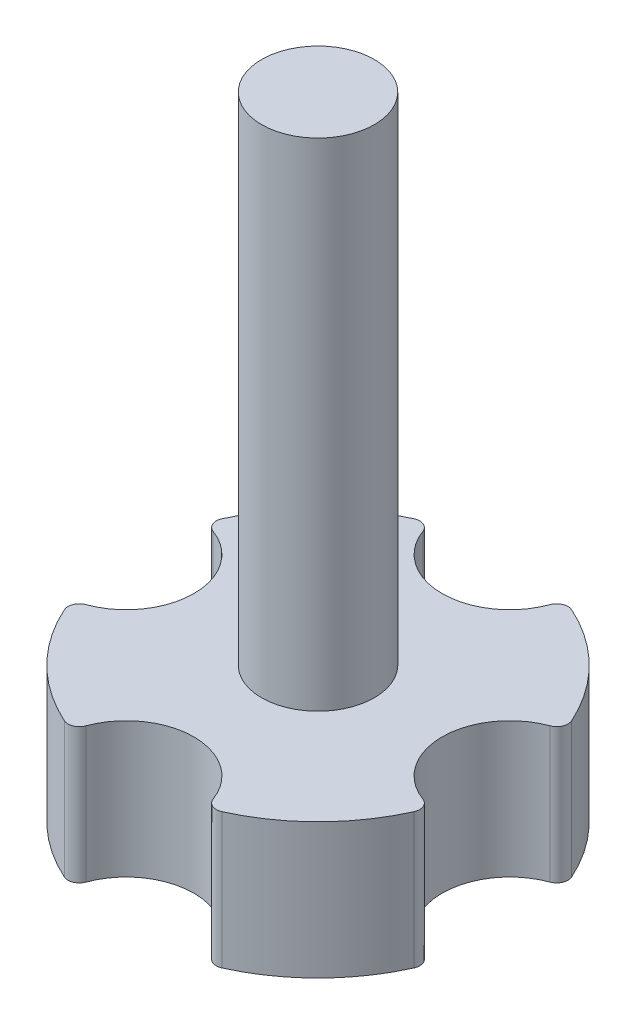
ISO-10303-21;
HEADER;
FILE_DESCRIPTION(('STEP AP214'),'2;1');
FILE_NAME('part.step','',(''),(''),'','','');
FILE_SCHEMA(('AUTOMOTIVE_DESIGN { 1 0 10303 214 1 1 1 1 }'));
ENDSEC;
DATA;
#1=APPLICATION_CONTEXT('core data for automotive mechanical design processes');
#2=APPLICATION_PROTOCOL_DEFINITION('international standard','automotive_design',2000,#1);
#3=PRODUCT_CONTEXT('',#1,'mechanical');
#4=PRODUCT('Part','Part','',(#3));
#5=PRODUCT_RELATED_PRODUCT_CATEGORY('part','',(#4));
#6=PRODUCT_DEFINITION_FORMATION('','',#4);
#7=PRODUCT_DEFINITION_CONTEXT('part definition',#1,'design');
#8=PRODUCT_DEFINITION('design','',#6,#7);
#9=PRODUCT_DEFINITION_SHAPE('','',#8);
#10=(LENGTH_UNIT() NAMED_UNIT(*) SI_UNIT(.MILLI.,.METRE.));
#11=(NAMED_UNIT(*) PLANE_ANGLE_UNIT() SI_UNIT($,.RADIAN.));
#12=(NAMED_UNIT(*) SI_UNIT($,.STERADIAN.) SOLID_ANGLE_UNIT());
#13=UNCERTAINTY_MEASURE_WITH_UNIT(LENGTH_MEASURE(1.E-05),#10,'distance_accuracy_value','');
#14=(GEOMETRIC_REPRESENTATION_CONTEXT(3) GLOBAL_UNCERTAINTY_ASSIGNED_CONTEXT((#13)) GLOBAL_UNIT_ASSIGNED_CONTEXT((#10,
#11,#12)) REPRESENTATION_CONTEXT('',''));
#15=CARTESIAN_POINT('',(0.,0.,0.));
#16=DIRECTION('',(0.,0.,1.));
#17=DIRECTION('',(1.,0.,0.));
#18=AXIS2_PLACEMENT_3D('',#15,#16,#17);
#19=CARTESIAN_POINT('',(0.,6.,0.));
#20=DIRECTION('',(0.,-1.,0.));
#21=DIRECTION('',(0.,0.,-1.));
#22=AXIS2_PLACEMENT_3D('',#19,#20,#21);
#23=CYLINDRICAL_SURFACE('',#22,8.5);
#24=CARTESIAN_POINT('',(0.,6.,0.));
#25=DIRECTION('',(0.,1.,0.));
#26=DIRECTION('',(0.,0.,1.));
#27=AXIS2_PLACEMENT_3D('',#24,#25,#26);
#28=CIRCLE('',#27,8.5);
#29=CARTESIAN_POINT('',(-7.75,6.,3.49106001094224));
#30=VERTEX_POINT('',#29);
#31=CARTESIAN_POINT('',(-3.49106001094223,6.,7.75));
#32=VERTEX_POINT('',#31);
#33=EDGE_CURVE('E173',#30,#32,#28,.T.);
#34=ORIENTED_EDGE('',*,*,#33,.F.);
#35=DIRECTION('',(0.,-1.,0.));
#36=VECTOR('',#35,1.);
#37=CARTESIAN_POINT('',(-7.75,6.,3.49106001094224));
#38=LINE('',#37,#36);
#39=CARTESIAN_POINT('',(-7.75,0.,3.49106001094224));
#40=VERTEX_POINT('',#39);
#41=EDGE_CURVE('E232',#30,#40,#38,.T.);
#42=ORIENTED_EDGE('',*,*,#41,.T.);
#43=CARTESIAN_POINT('',(0.,0.,0.));
#44=DIRECTION('',(0.,1.,0.));
#45=DIRECTION('',(0.,0.,1.));
#46=AXIS2_PLACEMENT_3D('',#43,#44,#45);
#47=CIRCLE('',#46,8.5);
#48=CARTESIAN_POINT('',(-3.49106001094223,0.,7.75));
#49=VERTEX_POINT('',#48);
#50=EDGE_CURVE('E258',#40,#49,#47,.T.);
#51=ORIENTED_EDGE('',*,*,#50,.T.);
#52=DIRECTION('',(0.,-1.,0.));
#53=VECTOR('',#52,1.);
#54=CARTESIAN_POINT('',(-3.49106001094223,6.,7.75));
#55=LINE('',#54,#53);
#56=EDGE_CURVE('E230',#49,#32,#55,.F.);
#57=ORIENTED_EDGE('',*,*,#56,.T.);
#58=EDGE_LOOP('',(#34,#42,#51,#57));
#59=FACE_BOUND('',#58,.T.);
#60=ADVANCED_FACE('F33',(#59),#23,.T.);
#61=CARTESIAN_POINT('',(3.49106001094223,0.,7.75));
#62=VERTEX_POINT('',#61);
#63=CARTESIAN_POINT('',(7.75,0.,3.49106001094223));
#64=VERTEX_POINT('',#63);
#65=EDGE_CURVE('E252',#62,#64,#47,.T.);
#66=ORIENTED_EDGE('',*,*,#65,.T.);
#67=DIRECTION('',(0.,-1.,0.));
#68=VECTOR('',#67,1.);
#69=CARTESIAN_POINT('',(7.75,6.,3.49106001094223));
#70=LINE('',#69,#68);
#71=CARTESIAN_POINT('',(7.75,6.,3.49106001094223));
#72=VERTEX_POINT('',#71);
#73=EDGE_CURVE('E213',#64,#72,#70,.F.);
#74=ORIENTED_EDGE('',*,*,#73,.T.);
#75=CARTESIAN_POINT('',(3.49106001094223,6.,7.75));
#76=VERTEX_POINT('',#75);
#77=EDGE_CURVE('E170',#76,#72,#28,.T.);
#78=ORIENTED_EDGE('',*,*,#77,.F.);
#79=DIRECTION('',(0.,-1.,0.));
#80=VECTOR('',#79,1.);
#81=CARTESIAN_POINT('',(3.49106001094223,6.,7.75));
#82=LINE('',#81,#80);
#83=EDGE_CURVE('E158',#76,#62,#82,.T.);
#84=ORIENTED_EDGE('',*,*,#83,.T.);
#85=EDGE_LOOP('',(#66,#74,#78,#84));
#86=FACE_BOUND('',#85,.T.);
#87=ADVANCED_FACE('F251',(#86),#23,.T.);
#88=CARTESIAN_POINT('',(7.75,6.,-3.49106001094223));
#89=VERTEX_POINT('',#88);
#90=CARTESIAN_POINT('',(3.49106001094224,6.,-7.75));
#91=VERTEX_POINT('',#90);
#92=EDGE_CURVE('E152',#89,#91,#28,.T.);
#93=ORIENTED_EDGE('',*,*,#92,.F.);
#94=DIRECTION('',(0.,-1.,0.));
#95=VECTOR('',#94,1.);
#96=CARTESIAN_POINT('',(7.75,6.,-3.49106001094223));
#97=LINE('',#96,#95);
#98=CARTESIAN_POINT('',(7.75,0.,-3.49106001094223));
#99=VERTEX_POINT('',#98);
#100=EDGE_CURVE('E166',#89,#99,#97,.T.);
#101=ORIENTED_EDGE('',*,*,#100,.T.);
#102=CARTESIAN_POINT('',(3.49106001094224,0.,-7.75));
#103=VERTEX_POINT('',#102);
#104=EDGE_CURVE('E259',#99,#103,#47,.T.);
#105=ORIENTED_EDGE('',*,*,#104,.T.);
#106=DIRECTION('',(0.,-1.,0.));
#107=VECTOR('',#106,1.);
#108=CARTESIAN_POINT('',(3.49106001094224,6.,-7.75));
#109=LINE('',#108,#107);
#110=EDGE_CURVE('E169',#103,#91,#109,.F.);
#111=ORIENTED_EDGE('',*,*,#110,.T.);
#112=EDGE_LOOP('',(#93,#101,#105,#111));
#113=FACE_BOUND('',#112,.T.);
#114=ADVANCED_FACE('F164',(#113),#23,.T.);
#115=CARTESIAN_POINT('',(0.,6.,0.));
#116=DIRECTION('',(0.,1.,0.));
#117=DIRECTION('',(0.,0.,1.));
#118=AXIS2_PLACEMENT_3D('',#115,#116,#117);
#119=PLANE('',#118);
#120=CARTESIAN_POINT('',(8.5,6.,0.));
#121=DIRECTION('',(0.,1.,0.));
#122=DIRECTION('',(0.,0.,1.));
#123=AXIS2_PLACEMENT_3D('',#120,#121,#122);
#124=CIRCLE('',#123,3.);
#125=CARTESIAN_POINT('',(7.46638655462185,6.,-2.81631731975172));
#126=VERTEX_POINT('',#125);
#127=CARTESIAN_POINT('',(7.46638655462185,6.,2.81631731975172));
#128=VERTEX_POINT('',#127);
#129=EDGE_CURVE('E154',#126,#128,#124,.T.);
#130=ORIENTED_EDGE('',*,*,#129,.F.);
#131=CARTESIAN_POINT('',(7.29411764705882,6.,-3.28570353971034));
#132=DIRECTION('',(0.,1.,0.));
#133=DIRECTION('',(0.,0.,1.));
#134=AXIS2_PLACEMENT_3D('',#131,#132,#133);
#135=CIRCLE('',#134,0.5);
#136=EDGE_CURVE('E148',#126,#89,#135,.T.);
#137=ORIENTED_EDGE('',*,*,#136,.T.);
#138=ORIENTED_EDGE('',*,*,#92,.T.);
#139=CARTESIAN_POINT('',(3.28570353971034,6.,-7.29411764705882));
#140=DIRECTION('',(0.,1.,0.));
#141=DIRECTION('',(0.,0.,1.));
#142=AXIS2_PLACEMENT_3D('',#139,#140,#141);
#143=CIRCLE('',#142,0.5);
#144=CARTESIAN_POINT('',(2.81631731975172,6.,-7.46638655462185));
#145=VERTEX_POINT('',#144);
#146=EDGE_CURVE('E208',#91,#145,#143,.T.);
#147=ORIENTED_EDGE('',*,*,#146,.T.);
#148=CARTESIAN_POINT('',(0.,6.,-8.5));
#149=DIRECTION('',(0.,1.,0.));
#150=DIRECTION('',(0.,0.,1.));
#151=AXIS2_PLACEMENT_3D('',#148,#149,#150);
#152=CIRCLE('',#151,3.);
#153=CARTESIAN_POINT('',(-2.81631731975172,6.,-7.46638655462185));
#154=VERTEX_POINT('',#153);
#155=EDGE_CURVE('E298',#154,#145,#152,.T.);
#156=ORIENTED_EDGE('',*,*,#155,.F.);
#157=CARTESIAN_POINT('',(-3.28570353971034,6.,-7.29411764705882));
#158=DIRECTION('',(0.,1.,0.));
#159=DIRECTION('',(0.,0.,1.));
#160=AXIS2_PLACEMENT_3D('',#157,#158,#159);
#161=CIRCLE('',#160,0.5);
#162=CARTESIAN_POINT('',(-3.49106001094224,6.,-7.75));
#163=VERTEX_POINT('',#162);
#164=EDGE_CURVE('E206',#154,#163,#161,.T.);
#165=ORIENTED_EDGE('',*,*,#164,.T.);
#166=CARTESIAN_POINT('',(-7.75,6.,-3.49106001094224));
#167=VERTEX_POINT('',#166);
#168=EDGE_CURVE('E171',#163,#167,#28,.T.);
#169=ORIENTED_EDGE('',*,*,#168,.T.);
#170=CARTESIAN_POINT('',(-7.29411764705882,6.,-3.28570353971034));
#171=DIRECTION('',(0.,1.,0.));
#172=DIRECTION('',(0.,0.,1.));
#173=AXIS2_PLACEMENT_3D('',#170,#171,#172);
#174=CIRCLE('',#173,0.5);
#175=CARTESIAN_POINT('',(-7.46638655462185,6.,-2.81631731975172));
#176=VERTEX_POINT('',#175);
#177=EDGE_CURVE('E204',#167,#176,#174,.T.);
#178=ORIENTED_EDGE('',*,*,#177,.T.);
#179=CARTESIAN_POINT('',(-8.5,6.,0.));
#180=DIRECTION('',(0.,1.,0.));
#181=DIRECTION('',(0.,0.,1.));
#182=AXIS2_PLACEMENT_3D('',#179,#180,#181);
#183=CIRCLE('',#182,3.);
#184=CARTESIAN_POINT('',(-7.46638655462185,6.,2.81631731975172));
#185=VERTEX_POINT('',#184);
#186=EDGE_CURVE('E452',#185,#176,#183,.T.);
#187=ORIENTED_EDGE('',*,*,#186,.F.);
#188=CARTESIAN_POINT('',(-7.29411764705882,6.,3.28570353971034));
#189=DIRECTION('',(0.,1.,0.));
#190=DIRECTION('',(0.,0.,1.));
#191=AXIS2_PLACEMENT_3D('',#188,#189,#190);
#192=CIRCLE('',#191,0.5);
#193=EDGE_CURVE('E56',#185,#30,#192,.T.);
#194=ORIENTED_EDGE('',*,*,#193,.T.);
#195=ORIENTED_EDGE('',*,*,#33,.T.);
#196=CARTESIAN_POINT('',(-3.28570353971034,6.,7.29411764705882));
#197=DIRECTION('',(0.,1.,0.));
#198=DIRECTION('',(0.,0.,1.));
#199=AXIS2_PLACEMENT_3D('',#196,#197,#198);
#200=CIRCLE('',#199,0.5);
#201=CARTESIAN_POINT('',(-2.81631731975172,6.,7.46638655462185));
#202=VERTEX_POINT('',#201);
#203=EDGE_CURVE('E48',#32,#202,#200,.T.);
#204=ORIENTED_EDGE('',*,*,#203,.T.);
#205=CARTESIAN_POINT('',(0.,6.,8.5));
#206=DIRECTION('',(0.,1.,0.));
#207=DIRECTION('',(0.,0.,1.));
#208=AXIS2_PLACEMENT_3D('',#205,#206,#207);
#209=CIRCLE('',#208,3.);
#210=CARTESIAN_POINT('',(2.81631731975172,6.,7.46638655462185));
#211=VERTEX_POINT('',#210);
#212=EDGE_CURVE('E240',#211,#202,#209,.T.);
#213=ORIENTED_EDGE('',*,*,#212,.F.);
#214=CARTESIAN_POINT('',(3.28570353971034,6.,7.29411764705882));
#215=DIRECTION('',(0.,1.,0.));
#216=DIRECTION('',(0.,0.,1.));
#217=AXIS2_PLACEMENT_3D('',#214,#215,#216);
#218=CIRCLE('',#217,0.5);
#219=EDGE_CURVE('E200',#211,#76,#218,.T.);
#220=ORIENTED_EDGE('',*,*,#219,.T.);
#221=ORIENTED_EDGE('',*,*,#77,.T.);
#222=CARTESIAN_POINT('',(7.29411764705882,6.,3.28570353971034));
#223=DIRECTION('',(0.,1.,0.));
#224=DIRECTION('',(0.,0.,1.));
#225=AXIS2_PLACEMENT_3D('',#222,#223,#224);
#226=CIRCLE('',#225,0.5);
#227=EDGE_CURVE('E159',#72,#128,#226,.T.);
#228=ORIENTED_EDGE('',*,*,#227,.T.);
#229=EDGE_LOOP('',(#130,#137,#138,#147,#156,#165,#169,#178,#187,#194,#195,#204,#213,#220,#221,#228));
#230=FACE_BOUND('',#229,.T.);
#231=CARTESIAN_POINT('',(0.,6.,0.));
#232=DIRECTION('',(0.,1.,0.));
#233=DIRECTION('',(0.,0.,1.));
#234=AXIS2_PLACEMENT_3D('',#231,#232,#233);
#235=CIRCLE('',#234,2.5);
#236=CARTESIAN_POINT('',(0.,6.,2.5));
#237=VERTEX_POINT('',#236);
#238=EDGE_CURVE('E453',#237,#237,#235,.T.);
#239=ORIENTED_EDGE('',*,*,#238,.F.);
#240=EDGE_LOOP('',(#239));
#241=FACE_BOUND('',#240,.T.);
#242=ADVANCED_FACE('F150',(#230,#241),#119,.T.);
#243=ORIENTED_EDGE('',*,*,#168,.F.);
#244=DIRECTION('',(0.,-1.,0.));
#245=VECTOR('',#244,1.);
#246=CARTESIAN_POINT('',(-3.49106001094224,6.,-7.75));
#247=LINE('',#246,#245);
#248=CARTESIAN_POINT('',(-3.49106001094224,0.,-7.75));
#249=VERTEX_POINT('',#248);
#250=EDGE_CURVE('E223',#163,#249,#247,.T.);
#251=ORIENTED_EDGE('',*,*,#250,.T.);
#252=CARTESIAN_POINT('',(-7.75,0.,-3.49106001094224));
#253=VERTEX_POINT('',#252);
#254=EDGE_CURVE('E262',#249,#253,#47,.T.);
#255=ORIENTED_EDGE('',*,*,#254,.T.);
#256=DIRECTION('',(0.,-1.,0.));
#257=VECTOR('',#256,1.);
#258=CARTESIAN_POINT('',(-7.75,6.,-3.49106001094224));
#259=LINE('',#258,#257);
#260=EDGE_CURVE('E220',#253,#167,#259,.F.);
#261=ORIENTED_EDGE('',*,*,#260,.T.);
#262=EDGE_LOOP('',(#243,#251,#255,#261));
#263=FACE_BOUND('',#262,.T.);
#264=ADVANCED_FACE('F286',(#263),#23,.T.);
#265=CARTESIAN_POINT('',(0.,0.,0.));
#266=DIRECTION('',(0.,1.,0.));
#267=DIRECTION('',(0.,0.,1.));
#268=AXIS2_PLACEMENT_3D('',#265,#266,#267);
#269=PLANE('',#268);
#270=ORIENTED_EDGE('',*,*,#104,.F.);
#271=CARTESIAN_POINT('',(7.29411764705882,0.,-3.28570353971034));
#272=DIRECTION('',(0.,1.,0.));
#273=DIRECTION('',(0.,0.,1.));
#274=AXIS2_PLACEMENT_3D('',#271,#272,#273);
#275=CIRCLE('',#274,0.5);
#276=CARTESIAN_POINT('',(7.46638655462185,0.,-2.81631731975172));
#277=VERTEX_POINT('',#276);
#278=EDGE_CURVE('E175',#99,#277,#275,.F.);
#279=ORIENTED_EDGE('',*,*,#278,.T.);
#280=CARTESIAN_POINT('',(8.5,0.,0.));
#281=DIRECTION('',(0.,1.,0.));
#282=DIRECTION('',(0.,0.,1.));
#283=AXIS2_PLACEMENT_3D('',#280,#281,#282);
#284=CIRCLE('',#283,3.);
#285=CARTESIAN_POINT('',(7.46638655462185,0.,2.81631731975172));
#286=VERTEX_POINT('',#285);
#287=EDGE_CURVE('E273',#277,#286,#284,.T.);
#288=ORIENTED_EDGE('',*,*,#287,.T.);
#289=CARTESIAN_POINT('',(7.29411764705882,0.,3.28570353971034));
#290=DIRECTION('',(0.,1.,0.));
#291=DIRECTION('',(0.,0.,1.));
#292=AXIS2_PLACEMENT_3D('',#289,#290,#291);
#293=CIRCLE('',#292,0.5);
#294=EDGE_CURVE('E193',#286,#64,#293,.F.);
#295=ORIENTED_EDGE('',*,*,#294,.T.);
#296=ORIENTED_EDGE('',*,*,#65,.F.);
#297=CARTESIAN_POINT('',(3.28570353971034,0.,7.29411764705882));
#298=DIRECTION('',(0.,1.,0.));
#299=DIRECTION('',(0.,0.,1.));
#300=AXIS2_PLACEMENT_3D('',#297,#298,#299);
#301=CIRCLE('',#300,0.5);
#302=CARTESIAN_POINT('',(2.81631731975172,0.,7.46638655462185));
#303=VERTEX_POINT('',#302);
#304=EDGE_CURVE('E176',#62,#303,#301,.F.);
#305=ORIENTED_EDGE('',*,*,#304,.T.);
#306=CARTESIAN_POINT('',(0.,0.,8.5));
#307=DIRECTION('',(0.,1.,0.));
#308=DIRECTION('',(0.,0.,1.));
#309=AXIS2_PLACEMENT_3D('',#306,#307,#308);
#310=CIRCLE('',#309,3.);
#311=CARTESIAN_POINT('',(-2.81631731975172,0.,7.46638655462185));
#312=VERTEX_POINT('',#311);
#313=EDGE_CURVE('E180',#303,#312,#310,.T.);
#314=ORIENTED_EDGE('',*,*,#313,.T.);
#315=CARTESIAN_POINT('',(-3.28570353971034,0.,7.29411764705882));
#316=DIRECTION('',(0.,1.,0.));
#317=DIRECTION('',(0.,0.,1.));
#318=AXIS2_PLACEMENT_3D('',#315,#316,#317);
#319=CIRCLE('',#318,0.5);
#320=EDGE_CURVE('E178',#312,#49,#319,.F.);
#321=ORIENTED_EDGE('',*,*,#320,.T.);
#322=ORIENTED_EDGE('',*,*,#50,.F.);
#323=CARTESIAN_POINT('',(-7.29411764705882,0.,3.28570353971034));
#324=DIRECTION('',(0.,1.,0.));
#325=DIRECTION('',(0.,0.,1.));
#326=AXIS2_PLACEMENT_3D('',#323,#324,#325);
#327=CIRCLE('',#326,0.5);
#328=CARTESIAN_POINT('',(-7.46638655462185,0.,2.81631731975172));
#329=VERTEX_POINT('',#328);
#330=EDGE_CURVE('E185',#40,#329,#327,.F.);
#331=ORIENTED_EDGE('',*,*,#330,.T.);
#332=CARTESIAN_POINT('',(-8.5,0.,0.));
#333=DIRECTION('',(0.,1.,0.));
#334=DIRECTION('',(0.,0.,1.));
#335=AXIS2_PLACEMENT_3D('',#332,#333,#334);
#336=CIRCLE('',#335,3.);
#337=CARTESIAN_POINT('',(-7.46638655462185,0.,-2.81631731975172));
#338=VERTEX_POINT('',#337);
#339=EDGE_CURVE('E267',#329,#338,#336,.T.);
#340=ORIENTED_EDGE('',*,*,#339,.T.);
#341=CARTESIAN_POINT('',(-7.29411764705882,0.,-3.28570353971034));
#342=DIRECTION('',(0.,1.,0.));
#343=DIRECTION('',(0.,0.,1.));
#344=AXIS2_PLACEMENT_3D('',#341,#342,#343);
#345=CIRCLE('',#344,0.5);
#346=EDGE_CURVE('E187',#338,#253,#345,.F.);
#347=ORIENTED_EDGE('',*,*,#346,.T.);
#348=ORIENTED_EDGE('',*,*,#254,.F.);
#349=CARTESIAN_POINT('',(-3.28570353971034,0.,-7.29411764705882));
#350=DIRECTION('',(0.,1.,0.));
#351=DIRECTION('',(0.,0.,1.));
#352=AXIS2_PLACEMENT_3D('',#349,#350,#351);
#353=CIRCLE('',#352,0.5);
#354=CARTESIAN_POINT('',(-2.81631731975172,0.,-7.46638655462185));
#355=VERTEX_POINT('',#354);
#356=EDGE_CURVE('E189',#249,#355,#353,.F.);
#357=ORIENTED_EDGE('',*,*,#356,.T.);
#358=CARTESIAN_POINT('',(0.,0.,-8.5));
#359=DIRECTION('',(0.,1.,0.));
#360=DIRECTION('',(0.,0.,1.));
#361=AXIS2_PLACEMENT_3D('',#358,#359,#360);
#362=CIRCLE('',#361,3.);
#363=CARTESIAN_POINT('',(2.81631731975172,0.,-7.46638655462185));
#364=VERTEX_POINT('',#363);
#365=EDGE_CURVE('E270',#355,#364,#362,.T.);
#366=ORIENTED_EDGE('',*,*,#365,.T.);
#367=CARTESIAN_POINT('',(3.28570353971034,0.,-7.29411764705882));
#368=DIRECTION('',(0.,1.,0.));
#369=DIRECTION('',(0.,0.,1.));
#370=AXIS2_PLACEMENT_3D('',#367,#368,#369);
#371=CIRCLE('',#370,0.5);
#372=EDGE_CURVE('E191',#364,#103,#371,.F.);
#373=ORIENTED_EDGE('',*,*,#372,.T.);
#374=EDGE_LOOP('',(#270,#279,#288,#295,#296,#305,#314,#321,#322,#331,#340,#347,#348,#357,#366,#373));
#375=FACE_BOUND('',#374,.T.);
#376=ADVANCED_FACE('F255',(#375),#269,.F.);
#377=CARTESIAN_POINT('',(0.,28.,0.));
#378=DIRECTION('',(0.,-1.,0.));
#379=DIRECTION('',(0.,0.,-1.));
#380=AXIS2_PLACEMENT_3D('',#377,#378,#379);
#381=CYLINDRICAL_SURFACE('',#380,2.5);
#382=CARTESIAN_POINT('',(0.,28.,0.));
#383=DIRECTION('',(0.,1.,0.));
#384=DIRECTION('',(0.,0.,1.));
#385=AXIS2_PLACEMENT_3D('',#382,#383,#384);
#386=CIRCLE('',#385,2.5);
#387=CARTESIAN_POINT('',(0.,28.,2.5));
#388=VERTEX_POINT('',#387);
#389=EDGE_CURVE('E265',#388,#388,#386,.T.);
#390=ORIENTED_EDGE('',*,*,#389,.F.);
#391=EDGE_LOOP('',(#390));
#392=FACE_BOUND('',#391,.T.);
#393=ORIENTED_EDGE('',*,*,#238,.T.);
#394=EDGE_LOOP('',(#393));
#395=FACE_BOUND('',#394,.T.);
#396=ADVANCED_FACE('F326',(#392,#395),#381,.T.);
#397=CARTESIAN_POINT('',(0.,28.,0.));
#398=DIRECTION('',(0.,1.,0.));
#399=DIRECTION('',(0.,0.,1.));
#400=AXIS2_PLACEMENT_3D('',#397,#398,#399);
#401=PLANE('',#400);
#402=ORIENTED_EDGE('',*,*,#389,.T.);
#403=EDGE_LOOP('',(#402));
#404=FACE_BOUND('',#403,.T.);
#405=ADVANCED_FACE('F359',(#404),#401,.T.);
#406=CARTESIAN_POINT('',(-8.5,-6.99999999999999,0.));
#407=DIRECTION('',(0.,1.,0.));
#408=DIRECTION('',(0.,0.,1.));
#409=AXIS2_PLACEMENT_3D('',#406,#407,#408);
#410=CYLINDRICAL_SURFACE('',#409,3.);
#411=ORIENTED_EDGE('',*,*,#186,.T.);
#412=DIRECTION('',(0.,1.,0.));
#413=VECTOR('',#412,1.);
#414=CARTESIAN_POINT('',(-7.46638655462185,-6.99999999999999,-2.81631731975172));
#415=LINE('',#414,#413);
#416=EDGE_CURVE('E228',#176,#338,#415,.F.);
#417=ORIENTED_EDGE('',*,*,#416,.T.);
#418=ORIENTED_EDGE('',*,*,#339,.F.);
#419=DIRECTION('',(0.,1.,0.));
#420=VECTOR('',#419,1.);
#421=CARTESIAN_POINT('',(-7.46638655462185,-6.99999999999999,2.81631731975172));
#422=LINE('',#421,#420);
#423=EDGE_CURVE('E226',#329,#185,#422,.T.);
#424=ORIENTED_EDGE('',*,*,#423,.T.);
#425=EDGE_LOOP('',(#411,#417,#418,#424));
#426=FACE_BOUND('',#425,.T.);
#427=ADVANCED_FACE('F354',(#426),#410,.F.);
#428=CARTESIAN_POINT('',(0.,-6.99999999999999,-8.5));
#429=DIRECTION('',(0.,1.,0.));
#430=DIRECTION('',(0.,0.,1.));
#431=AXIS2_PLACEMENT_3D('',#428,#429,#430);
#432=CYLINDRICAL_SURFACE('',#431,3.);
#433=ORIENTED_EDGE('',*,*,#155,.T.);
#434=DIRECTION('',(0.,1.,0.));
#435=VECTOR('',#434,1.);
#436=CARTESIAN_POINT('',(2.81631731975172,-6.99999999999999,-7.46638655462185));
#437=LINE('',#436,#435);
#438=EDGE_CURVE('E218',#145,#364,#437,.F.);
#439=ORIENTED_EDGE('',*,*,#438,.T.);
#440=ORIENTED_EDGE('',*,*,#365,.F.);
#441=DIRECTION('',(0.,1.,0.));
#442=VECTOR('',#441,1.);
#443=CARTESIAN_POINT('',(-2.81631731975172,-6.99999999999999,-7.46638655462185));
#444=LINE('',#443,#442);
#445=EDGE_CURVE('E216',#355,#154,#444,.T.);
#446=ORIENTED_EDGE('',*,*,#445,.T.);
#447=EDGE_LOOP('',(#433,#439,#440,#446));
#448=FACE_BOUND('',#447,.T.);
#449=ADVANCED_FACE('F296',(#448),#432,.F.);
#450=CARTESIAN_POINT('',(8.5,-6.99999999999999,0.));
#451=DIRECTION('',(0.,1.,0.));
#452=DIRECTION('',(0.,0.,1.));
#453=AXIS2_PLACEMENT_3D('',#450,#451,#452);
#454=CYLINDRICAL_SURFACE('',#453,3.);
#455=ORIENTED_EDGE('',*,*,#287,.F.);
#456=DIRECTION('',(0.,1.,0.));
#457=VECTOR('',#456,1.);
#458=CARTESIAN_POINT('',(7.46638655462185,-6.99999999999999,-2.81631731975172));
#459=LINE('',#458,#457);
#460=EDGE_CURVE('E198',#277,#126,#459,.T.);
#461=ORIENTED_EDGE('',*,*,#460,.T.);
#462=ORIENTED_EDGE('',*,*,#129,.T.);
#463=DIRECTION('',(0.,1.,0.));
#464=VECTOR('',#463,1.);
#465=CARTESIAN_POINT('',(7.46638655462185,-6.99999999999999,2.81631731975172));
#466=LINE('',#465,#464);
#467=EDGE_CURVE('E196',#128,#286,#466,.F.);
#468=ORIENTED_EDGE('',*,*,#467,.T.);
#469=EDGE_LOOP('',(#455,#461,#462,#468));
#470=FACE_BOUND('',#469,.T.);
#471=ADVANCED_FACE('F303',(#470),#454,.F.);
#472=CARTESIAN_POINT('',(0.,-6.99999999999999,8.5));
#473=DIRECTION('',(0.,1.,0.));
#474=DIRECTION('',(0.,0.,1.));
#475=AXIS2_PLACEMENT_3D('',#472,#473,#474);
#476=CYLINDRICAL_SURFACE('',#475,3.);
#477=ORIENTED_EDGE('',*,*,#212,.T.);
#478=DIRECTION('',(0.,1.,0.));
#479=VECTOR('',#478,1.);
#480=CARTESIAN_POINT('',(-2.81631731975172,-6.99999999999999,7.46638655462185));
#481=LINE('',#480,#479);
#482=EDGE_CURVE('E11',#202,#312,#481,.F.);
#483=ORIENTED_EDGE('',*,*,#482,.T.);
#484=ORIENTED_EDGE('',*,*,#313,.F.);
#485=DIRECTION('',(0.,1.,0.));
#486=VECTOR('',#485,1.);
#487=CARTESIAN_POINT('',(2.81631731975172,-6.99999999999999,7.46638655462185));
#488=LINE('',#487,#486);
#489=EDGE_CURVE('E41',#303,#211,#488,.T.);
#490=ORIENTED_EDGE('',*,*,#489,.T.);
#491=EDGE_LOOP('',(#477,#483,#484,#490));
#492=FACE_BOUND('',#491,.T.);
#493=ADVANCED_FACE('F239',(#492),#476,.F.);
#494=CARTESIAN_POINT('',(7.29411764705882,-6.99999999999999,-3.28570353971034));
#495=DIRECTION('',(0.,1.,0.));
#496=DIRECTION('',(0.,0.,1.));
#497=AXIS2_PLACEMENT_3D('',#494,#495,#496);
#498=CYLINDRICAL_SURFACE('',#497,0.5);
#499=ORIENTED_EDGE('',*,*,#136,.F.);
#500=ORIENTED_EDGE('',*,*,#460,.F.);
#501=ORIENTED_EDGE('',*,*,#278,.F.);
#502=ORIENTED_EDGE('',*,*,#100,.F.);
#503=EDGE_LOOP('',(#499,#500,#501,#502));
#504=FACE_BOUND('',#503,.T.);
#505=ADVANCED_FACE('F174',(#504),#498,.T.);
#506=CARTESIAN_POINT('',(7.29411764705882,-6.99999999999999,3.28570353971034));
#507=DIRECTION('',(0.,-1.,0.));
#508=DIRECTION('',(0.,0.,-1.));
#509=AXIS2_PLACEMENT_3D('',#506,#507,#508);
#510=CYLINDRICAL_SURFACE('',#509,0.5);
#511=ORIENTED_EDGE('',*,*,#294,.F.);
#512=ORIENTED_EDGE('',*,*,#467,.F.);
#513=ORIENTED_EDGE('',*,*,#227,.F.);
#514=ORIENTED_EDGE('',*,*,#73,.F.);
#515=EDGE_LOOP('',(#511,#512,#513,#514));
#516=FACE_BOUND('',#515,.T.);
#517=ADVANCED_FACE('F306',(#516),#510,.T.);
#518=CARTESIAN_POINT('',(3.28570353971034,-6.99999999999999,-7.29411764705882));
#519=DIRECTION('',(0.,-1.,0.));
#520=DIRECTION('',(0.,0.,-1.));
#521=AXIS2_PLACEMENT_3D('',#518,#519,#520);
#522=CYLINDRICAL_SURFACE('',#521,0.5);
#523=ORIENTED_EDGE('',*,*,#372,.F.);
#524=ORIENTED_EDGE('',*,*,#438,.F.);
#525=ORIENTED_EDGE('',*,*,#146,.F.);
#526=ORIENTED_EDGE('',*,*,#110,.F.);
#527=EDGE_LOOP('',(#523,#524,#525,#526));
#528=FACE_BOUND('',#527,.T.);
#529=ADVANCED_FACE('F300',(#528),#522,.T.);
#530=CARTESIAN_POINT('',(-3.28570353971034,-6.99999999999999,-7.29411764705882));
#531=DIRECTION('',(0.,1.,0.));
#532=DIRECTION('',(0.,0.,1.));
#533=AXIS2_PLACEMENT_3D('',#530,#531,#532);
#534=CYLINDRICAL_SURFACE('',#533,0.5);
#535=ORIENTED_EDGE('',*,*,#164,.F.);
#536=ORIENTED_EDGE('',*,*,#445,.F.);
#537=ORIENTED_EDGE('',*,*,#356,.F.);
#538=ORIENTED_EDGE('',*,*,#250,.F.);
#539=EDGE_LOOP('',(#535,#536,#537,#538));
#540=FACE_BOUND('',#539,.T.);
#541=ADVANCED_FACE('F290',(#540),#534,.T.);
#542=CARTESIAN_POINT('',(-7.29411764705882,-6.99999999999999,-3.28570353971034));
#543=DIRECTION('',(0.,-1.,0.));
#544=DIRECTION('',(0.,0.,-1.));
#545=AXIS2_PLACEMENT_3D('',#542,#543,#544);
#546=CYLINDRICAL_SURFACE('',#545,0.5);
#547=ORIENTED_EDGE('',*,*,#346,.F.);
#548=ORIENTED_EDGE('',*,*,#416,.F.);
#549=ORIENTED_EDGE('',*,*,#177,.F.);
#550=ORIENTED_EDGE('',*,*,#260,.F.);
#551=EDGE_LOOP('',(#547,#548,#549,#550));
#552=FACE_BOUND('',#551,.T.);
#553=ADVANCED_FACE('F411',(#552),#546,.T.);
#554=CARTESIAN_POINT('',(-7.29411764705882,-6.99999999999999,3.28570353971034));
#555=DIRECTION('',(0.,1.,0.));
#556=DIRECTION('',(0.,0.,1.));
#557=AXIS2_PLACEMENT_3D('',#554,#555,#556);
#558=CYLINDRICAL_SURFACE('',#557,0.5);
#559=ORIENTED_EDGE('',*,*,#193,.F.);
#560=ORIENTED_EDGE('',*,*,#423,.F.);
#561=ORIENTED_EDGE('',*,*,#330,.F.);
#562=ORIENTED_EDGE('',*,*,#41,.F.);
#563=EDGE_LOOP('',(#559,#560,#561,#562));
#564=FACE_BOUND('',#563,.T.);
#565=ADVANCED_FACE('F420',(#564),#558,.T.);
#566=CARTESIAN_POINT('',(-3.28570353971034,-6.99999999999999,7.29411764705882));
#567=DIRECTION('',(0.,-1.,0.));
#568=DIRECTION('',(0.,0.,-1.));
#569=AXIS2_PLACEMENT_3D('',#566,#567,#568);
#570=CYLINDRICAL_SURFACE('',#569,0.5);
#571=ORIENTED_EDGE('',*,*,#320,.F.);
#572=ORIENTED_EDGE('',*,*,#482,.F.);
#573=ORIENTED_EDGE('',*,*,#203,.F.);
#574=ORIENTED_EDGE('',*,*,#56,.F.);
#575=EDGE_LOOP('',(#571,#572,#573,#574));
#576=FACE_BOUND('',#575,.T.);
#577=ADVANCED_FACE('F276',(#576),#570,.T.);
#578=CARTESIAN_POINT('',(3.28570353971034,-6.99999999999999,7.29411764705882));
#579=DIRECTION('',(0.,1.,0.));
#580=DIRECTION('',(0.,0.,1.));
#581=AXIS2_PLACEMENT_3D('',#578,#579,#580);
#582=CYLINDRICAL_SURFACE('',#581,0.5);
#583=ORIENTED_EDGE('',*,*,#219,.F.);
#584=ORIENTED_EDGE('',*,*,#489,.F.);
#585=ORIENTED_EDGE('',*,*,#304,.F.);
#586=ORIENTED_EDGE('',*,*,#83,.F.);
#587=EDGE_LOOP('',(#583,#584,#585,#586));
#588=FACE_BOUND('',#587,.T.);
#589=ADVANCED_FACE('F35',(#588),#582,.T.);
#590=CLOSED_SHELL('',(#60,#87,#114,#242,#264,#376,#396,#405,#427,#449,#471,#493,#505,#517,#529,
#541,#553,#565,#577,#589));
#591=MANIFOLD_SOLID_BREP('B2',#590);
#592=ADVANCED_BREP_SHAPE_REPRESENTATION('',(#18,#591),#14);
#593=SHAPE_DEFINITION_REPRESENTATION(#9,#592);
ENDSEC;
END-ISO-10303-21;
